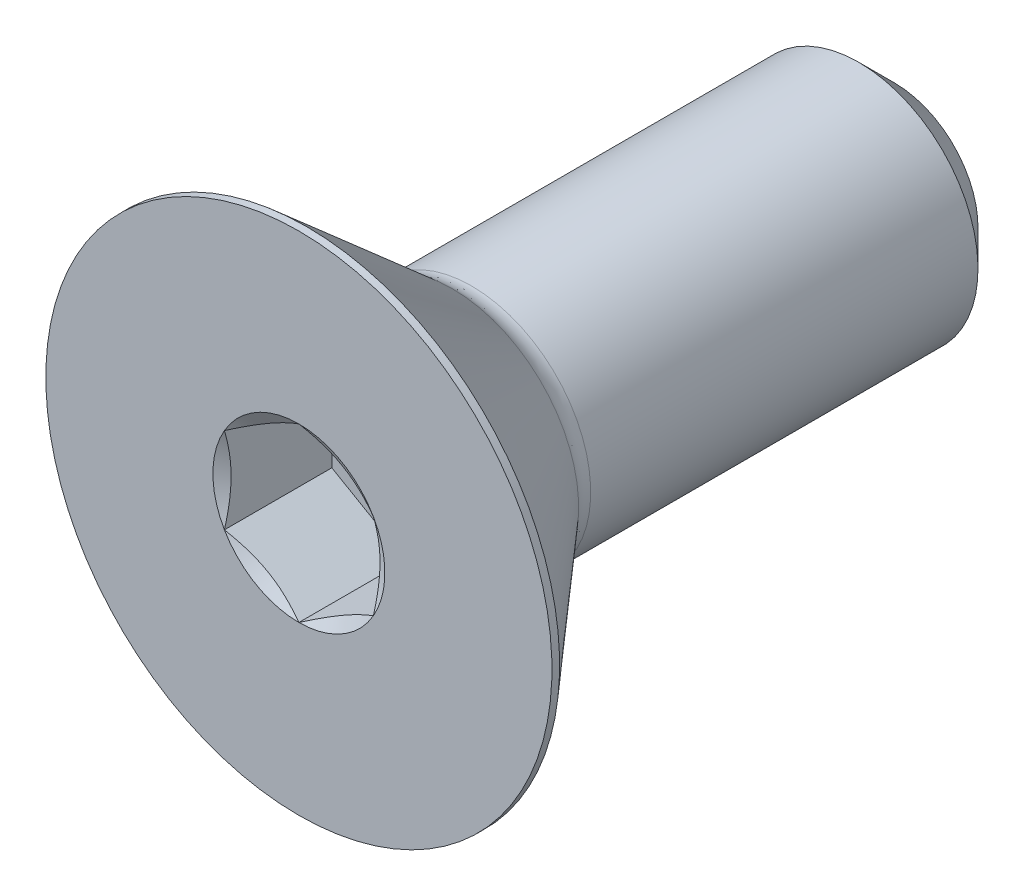
ISO-10303-21;
HEADER;
FILE_DESCRIPTION(('STEP AP214'),'2;1');
FILE_NAME('part.step','',(''),(''),'','','');
FILE_SCHEMA(('AUTOMOTIVE_DESIGN { 1 0 10303 214 1 1 1 1 }'));
ENDSEC;
DATA;
#1=APPLICATION_CONTEXT('core data for automotive mechanical design processes');
#2=APPLICATION_PROTOCOL_DEFINITION('international standard','automotive_design',2000,#1);
#3=PRODUCT_CONTEXT('',#1,'mechanical');
#4=PRODUCT('Part','Part','',(#3));
#5=PRODUCT_RELATED_PRODUCT_CATEGORY('part','',(#4));
#6=PRODUCT_DEFINITION_FORMATION('','',#4);
#7=PRODUCT_DEFINITION_CONTEXT('part definition',#1,'design');
#8=PRODUCT_DEFINITION('design','',#6,#7);
#9=PRODUCT_DEFINITION_SHAPE('','',#8);
#10=(LENGTH_UNIT() NAMED_UNIT(*) SI_UNIT(.MILLI.,.METRE.));
#11=(NAMED_UNIT(*) PLANE_ANGLE_UNIT() SI_UNIT($,.RADIAN.));
#12=(NAMED_UNIT(*) SI_UNIT($,.STERADIAN.) SOLID_ANGLE_UNIT());
#13=UNCERTAINTY_MEASURE_WITH_UNIT(LENGTH_MEASURE(1.E-05),#10,'distance_accuracy_value','');
#14=(GEOMETRIC_REPRESENTATION_CONTEXT(3) GLOBAL_UNCERTAINTY_ASSIGNED_CONTEXT((#13)) GLOBAL_UNIT_ASSIGNED_CONTEXT((#10,
#11,#12)) REPRESENTATION_CONTEXT('',''));
#15=CARTESIAN_POINT('',(0.,0.,0.));
#16=DIRECTION('',(0.,0.,1.));
#17=DIRECTION('',(1.,0.,0.));
#18=AXIS2_PLACEMENT_3D('',#15,#16,#17);
#19=CARTESIAN_POINT('',(0.,0.,-15.875));
#20=DIRECTION('',(0.,0.,-1.));
#21=DIRECTION('',(0.,1.,0.));
#22=AXIS2_PLACEMENT_3D('',#19,#20,#21);
#23=CYLINDRICAL_SURFACE('',#22,3.175);
#24=CARTESIAN_POINT('',(0.,0.,-14.9225));
#25=DIRECTION('',(0.,0.,-1.));
#26=DIRECTION('',(0.,1.,0.));
#27=AXIS2_PLACEMENT_3D('',#24,#25,#26);
#28=CIRCLE('',#27,3.175);
#29=CARTESIAN_POINT('',(0.,3.175,-14.9225));
#30=VERTEX_POINT('',#29);
#31=EDGE_CURVE('E49',#30,#30,#28,.F.);
#32=ORIENTED_EDGE('',*,*,#31,.T.);
#33=EDGE_LOOP('',(#32));
#34=FACE_BOUND('',#33,.T.);
#35=CARTESIAN_POINT('',(0.,0.,-4.60180899712602));
#36=DIRECTION('',(0.,0.,1.));
#37=DIRECTION('',(0.,-1.,0.));
#38=AXIS2_PLACEMENT_3D('',#35,#36,#37);
#39=CIRCLE('',#38,3.175);
#40=CARTESIAN_POINT('',(0.,-3.175,-4.60180899712602));
#41=VERTEX_POINT('',#40);
#42=EDGE_CURVE('E208',#41,#41,#39,.T.);
#43=ORIENTED_EDGE('',*,*,#42,.F.);
#44=EDGE_LOOP('',(#43));
#45=FACE_BOUND('',#44,.T.);
#46=ADVANCED_FACE('F36',(#34,#45),#23,.T.);
#47=CARTESIAN_POINT('',(0.,-3.175,-15.875));
#48=DIRECTION('',(0.,0.,-1.));
#49=DIRECTION('',(0.,1.,0.));
#50=AXIS2_PLACEMENT_3D('',#47,#48,#49);
#51=PLANE('',#50);
#52=CARTESIAN_POINT('',(0.,0.,-15.875));
#53=DIRECTION('',(0.,0.,-1.));
#54=DIRECTION('',(0.,1.,0.));
#55=AXIS2_PLACEMENT_3D('',#52,#53,#54);
#56=CIRCLE('',#55,2.2225);
#57=CARTESIAN_POINT('',(0.,2.2225,-15.875));
#58=VERTEX_POINT('',#57);
#59=EDGE_CURVE('E211',#58,#58,#56,.T.);
#60=ORIENTED_EDGE('',*,*,#59,.T.);
#61=EDGE_LOOP('',(#60));
#62=FACE_BOUND('',#61,.T.);
#63=ADVANCED_FACE('F221',(#62),#51,.T.);
#64=CARTESIAN_POINT('',(0.,0.,-15.875));
#65=DIRECTION('',(0.,0.,1.));
#66=DIRECTION('',(0.,-1.,0.));
#67=AXIS2_PLACEMENT_3D('',#64,#65,#66);
#68=CONICAL_SURFACE('',#67,2.2225,0.785398163397446);
#69=ORIENTED_EDGE('',*,*,#31,.F.);
#70=EDGE_LOOP('',(#69));
#71=FACE_BOUND('',#70,.T.);
#72=ORIENTED_EDGE('',*,*,#59,.F.);
#73=EDGE_LOOP('',(#72));
#74=FACE_BOUND('',#73,.T.);
#75=ADVANCED_FACE('F38',(#71,#74),#68,.T.);
#76=CARTESIAN_POINT('',(0.,0.,-4.60180899712602));
#77=DIRECTION('',(0.,0.,1.));
#78=DIRECTION('',(0.,-1.,0.));
#79=AXIS2_PLACEMENT_3D('',#76,#77,#78);
#80=TOROIDAL_SURFACE('',#79,3.95604099552517,0.781040995525164);
#81=CARTESIAN_POINT('',(0.,0.,-4.0894));
#82=DIRECTION('',(0.,0.,1.));
#83=DIRECTION('',(0.,-1.,0.));
#84=AXIS2_PLACEMENT_3D('',#81,#82,#83);
#85=CIRCLE('',#84,3.36658187365559);
#86=CARTESIAN_POINT('',(0.,-3.36658187365559,-4.0894));
#87=VERTEX_POINT('',#86);
#88=EDGE_CURVE('E205',#87,#87,#85,.T.);
#89=ORIENTED_EDGE('',*,*,#88,.F.);
#90=EDGE_LOOP('',(#89));
#91=FACE_BOUND('',#90,.T.);
#92=ORIENTED_EDGE('',*,*,#42,.T.);
#93=EDGE_LOOP('',(#92));
#94=FACE_BOUND('',#93,.T.);
#95=ADVANCED_FACE('F220',(#91,#94),#80,.F.);
#96=CARTESIAN_POINT('',(0.,0.,-4.0894));
#97=DIRECTION('',(0.,0.,1.));
#98=DIRECTION('',(0.,-1.,0.));
#99=AXIS2_PLACEMENT_3D('',#96,#97,#98);
#100=CONICAL_SURFACE('',#99,3.36658187365559,0.715584993317677);
#101=CARTESIAN_POINT('',(0.,0.,-0.204469999999999));
#102=DIRECTION('',(0.,0.,1.));
#103=DIRECTION('',(0.,-1.,0.));
#104=AXIS2_PLACEMENT_3D('',#101,#102,#103);
#105=CIRCLE('',#104,6.7437);
#106=CARTESIAN_POINT('',(0.,-6.7437,-0.204469999999999));
#107=VERTEX_POINT('',#106);
#108=EDGE_CURVE('E202',#107,#107,#105,.T.);
#109=ORIENTED_EDGE('',*,*,#108,.F.);
#110=EDGE_LOOP('',(#109));
#111=FACE_BOUND('',#110,.T.);
#112=ORIENTED_EDGE('',*,*,#88,.T.);
#113=EDGE_LOOP('',(#112));
#114=FACE_BOUND('',#113,.T.);
#115=ADVANCED_FACE('F233',(#111,#114),#100,.T.);
#116=CARTESIAN_POINT('',(0.,0.,0.));
#117=DIRECTION('',(0.,0.,1.));
#118=DIRECTION('',(0.,-1.,0.));
#119=AXIS2_PLACEMENT_3D('',#116,#117,#118);
#120=CYLINDRICAL_SURFACE('',#119,6.7437);
#121=CARTESIAN_POINT('',(0.,0.,0.));
#122=DIRECTION('',(0.,0.,1.));
#123=DIRECTION('',(0.,-1.,0.));
#124=AXIS2_PLACEMENT_3D('',#121,#122,#123);
#125=CIRCLE('',#124,6.7437);
#126=CARTESIAN_POINT('',(0.,-6.7437,0.));
#127=VERTEX_POINT('',#126);
#128=EDGE_CURVE('E190',#127,#127,#125,.T.);
#129=ORIENTED_EDGE('',*,*,#128,.F.);
#130=EDGE_LOOP('',(#129));
#131=FACE_BOUND('',#130,.T.);
#132=ORIENTED_EDGE('',*,*,#108,.T.);
#133=EDGE_LOOP('',(#132));
#134=FACE_BOUND('',#133,.T.);
#135=ADVANCED_FACE('F165',(#131,#134),#120,.T.);
#136=CARTESIAN_POINT('',(0.,-3.175,0.));
#137=DIRECTION('',(0.,0.,1.));
#138=DIRECTION('',(0.,-1.,0.));
#139=AXIS2_PLACEMENT_3D('',#136,#137,#138);
#140=PLANE('',#139);
#141=CARTESIAN_POINT('',(0.,0.,0.));
#142=DIRECTION('',(0.,0.,1.));
#143=DIRECTION('',(1.,0.,0.));
#144=AXIS2_PLACEMENT_3D('',#141,#142,#143);
#145=CIRCLE('',#144,2.29135888084633);
#146=CARTESIAN_POINT('',(0.,-2.29135888084633,0.));
#147=VERTEX_POINT('',#146);
#148=CARTESIAN_POINT('',(1.984375,-1.14567944042316,0.));
#149=VERTEX_POINT('',#148);
#150=EDGE_CURVE('E62',#147,#149,#145,.T.);
#151=ORIENTED_EDGE('',*,*,#150,.F.);
#152=CARTESIAN_POINT('',(-1.984375,-1.14567944042316,0.));
#153=VERTEX_POINT('',#152);
#154=EDGE_CURVE('E134',#153,#147,#145,.T.);
#155=ORIENTED_EDGE('',*,*,#154,.F.);
#156=CARTESIAN_POINT('',(-1.984375,1.14567944042317,0.));
#157=VERTEX_POINT('',#156);
#158=EDGE_CURVE('E133',#157,#153,#145,.T.);
#159=ORIENTED_EDGE('',*,*,#158,.F.);
#160=CARTESIAN_POINT('',(0.,2.29135888084633,0.));
#161=VERTEX_POINT('',#160);
#162=EDGE_CURVE('E103',#161,#157,#145,.T.);
#163=ORIENTED_EDGE('',*,*,#162,.F.);
#164=CARTESIAN_POINT('',(1.984375,1.14567944042316,0.));
#165=VERTEX_POINT('',#164);
#166=EDGE_CURVE('E94',#165,#161,#145,.T.);
#167=ORIENTED_EDGE('',*,*,#166,.F.);
#168=EDGE_CURVE('E55',#149,#165,#145,.T.);
#169=ORIENTED_EDGE('',*,*,#168,.F.);
#170=EDGE_LOOP('',(#151,#155,#159,#163,#167,#169));
#171=FACE_BOUND('',#170,.T.);
#172=ORIENTED_EDGE('',*,*,#128,.T.);
#173=EDGE_LOOP('',(#172));
#174=FACE_BOUND('',#173,.T.);
#175=ADVANCED_FACE('F129',(#171,#174),#140,.T.);
#176=CARTESIAN_POINT('',(0.,0.,0.));
#177=DIRECTION('',(0.,0.,1.));
#178=DIRECTION('',(1.,0.,0.));
#179=AXIS2_PLACEMENT_3D('',#176,#177,#178);
#180=CONICAL_SURFACE('',#179,2.29135888084633,1.0471975511966);
#181=ORIENTED_EDGE('',*,*,#162,.T.);
#182=CARTESIAN_POINT('',(0.000199999999999609,2.29147435090017,6.66717057831416E-05));
#183=CARTESIAN_POINT('',(-0.0870046387806768,2.24112672922556,-0.029014317759813));
#184=CARTESIAN_POINT('',(-0.174962019304997,2.19034451190263,-0.0554627919729485));
#185=CARTESIAN_POINT('',(-0.35239997867232,2.08790065829745,-0.101629728793529));
#186=CARTESIAN_POINT('',(-0.441883711256319,2.03623720120198,-0.121331857751036));
#187=CARTESIAN_POINT('',(-0.619742148012469,1.93355058486317,-0.152002268068471));
#188=CARTESIAN_POINT('',(-0.708089480306094,1.88254322878126,-0.163174657279787));
#189=CARTESIAN_POINT('',(-0.88520002811095,1.78028840632981,-0.176514203945575));
#190=CARTESIAN_POINT('',(-0.973962599510547,1.72904131183829,-0.178692405539878));
#191=CARTESIAN_POINT('',(-1.13983230286466,1.63327639395638,-0.174170448491651));
#192=CARTESIAN_POINT('',(-1.21696421566591,1.58874426333747,-0.168580586544127));
#193=CARTESIAN_POINT('',(-1.37072550718908,1.49997014028563,-0.150861066102989));
#194=CARTESIAN_POINT('',(-1.44735435374552,1.45572845509857,-0.138725349670475));
#195=CARTESIAN_POINT('',(-1.60143288850678,1.36677117157782,-0.108385841155635));
#196=CARTESIAN_POINT('',(-1.67886306721268,1.32206683705857,-0.09005339070901));
#197=CARTESIAN_POINT('',(-1.83256831124359,1.23332507304146,-0.0484454935998176));
#198=CARTESIAN_POINT('',(-1.90884534705293,1.18928650588395,-0.0251798287176209));
#199=CARTESIAN_POINT('',(-1.984575,1.14556397036933,6.66717057829762E-05));
#200=B_SPLINE_CURVE_WITH_KNOTS('',3,(#182,#183,#184,#185,#186,#187,#188,#189,#190,#191,#192,
#193,#194,#195,#196,#197,#198,#199),.UNSPECIFIED.,.F.,.F.,(4,2,2,2,2,2,2,2,4),(0.,
0.314555137114086,0.629866549668806,0.937373439505933,1.24450262309398,1.51196650590478,
1.77967834211415,2.05332989762155,2.32644383656793),.UNSPECIFIED.);
#201=EDGE_CURVE('E11',#161,#157,#200,.T.);
#202=ORIENTED_EDGE('',*,*,#201,.F.);
#203=EDGE_LOOP('',(#181,#202));
#204=FACE_BOUND('',#203,.T.);
#205=ADVANCED_FACE('F107',(#204),#180,.F.);
#206=ORIENTED_EDGE('',*,*,#158,.T.);
#207=CARTESIAN_POINT('',(-1.984375,-2.96692860034507,0.737860651092377));
#208=CARTESIAN_POINT('',(-1.984375,-2.88123645369667,0.69674880177529));
#209=CARTESIAN_POINT('',(-1.984375,-2.79533554929687,0.656063972956056));
#210=CARTESIAN_POINT('',(-1.984375,-2.62300496253372,0.575790597945192));
#211=CARTESIAN_POINT('',(-1.984375,-2.53657518838115,0.536202249047077));
#212=CARTESIAN_POINT('',(-1.984375,-2.36258003650985,0.458142914429596));
#213=CARTESIAN_POINT('',(-1.984375,-2.27501095051754,0.419680163398946));
#214=CARTESIAN_POINT('',(-1.984375,-2.09913795632987,0.344479427097519));
#215=CARTESIAN_POINT('',(-1.984375,-2.01083408662377,0.307741352146445));
#216=CARTESIAN_POINT('',(-1.984375,-1.83102497893539,0.235513729354963));
#217=CARTESIAN_POINT('',(-1.984375,-1.73949640320228,0.200081939073892));
#218=CARTESIAN_POINT('',(-1.984375,-1.55533214713673,0.132164183556778));
#219=CARTESIAN_POINT('',(-1.984375,-1.46269633980312,0.0996785599926462));
#220=CARTESIAN_POINT('',(-1.984375,-1.27638419434466,0.0385821363592113));
#221=CARTESIAN_POINT('',(-1.984375,-1.18271082678456,0.00996237523819853));
#222=CARTESIAN_POINT('',(-1.984375,-0.994021652382587,-0.0424236311394211));
#223=CARTESIAN_POINT('',(-1.984375,-0.899006185229732,-0.0661910818015453));
#224=CARTESIAN_POINT('',(-1.984375,-0.70783051245842,-0.107605260619429));
#225=CARTESIAN_POINT('',(-1.984375,-0.611673084373239,-0.125264559933971));
#226=CARTESIAN_POINT('',(-1.984375,-0.418283092113672,-0.153306903466505));
#227=CARTESIAN_POINT('',(-1.984375,-0.32105060104525,-0.163690439394072));
#228=CARTESIAN_POINT('',(-1.984375,-0.127210752774483,-0.176214799009401));
#229=CARTESIAN_POINT('',(-1.984375,-0.0306098639781231,-0.178452892631436));
#230=CARTESIAN_POINT('',(-1.984375,0.162431915887106,-0.17475795296783));
#231=CARTESIAN_POINT('',(-1.984375,0.258872796678698,-0.168824413724938));
#232=CARTESIAN_POINT('',(-1.984375,0.496826477184735,-0.144624426308478));
#233=CARTESIAN_POINT('',(-1.984375,0.637878211825128,-0.121822779785831));
#234=CARTESIAN_POINT('',(-1.984375,0.91723870370253,-0.0630239757386336));
#235=CARTESIAN_POINT('',(-1.984375,1.05554394232965,-0.0270109144574765));
#236=CARTESIAN_POINT('',(-1.984375,1.26239464896717,0.0345082078903479));
#237=CARTESIAN_POINT('',(-1.984375,1.33200934564274,0.0565514264145546));
#238=CARTESIAN_POINT('',(-1.984375,1.47051409380588,0.102676986257499));
#239=CARTESIAN_POINT('',(-1.984375,1.53940456776433,0.126758055006123));
#240=CARTESIAN_POINT('',(-1.984375,1.67655293465251,0.176609588689456));
#241=CARTESIAN_POINT('',(-1.984375,1.74481093998431,0.202379746602285));
#242=CARTESIAN_POINT('',(-1.984375,1.88078910071683,0.255330712681564));
#243=CARTESIAN_POINT('',(-1.984375,1.94850916300286,0.282511759182964));
#244=CARTESIAN_POINT('',(-1.984375,2.12136731788458,0.353633623835928));
#245=CARTESIAN_POINT('',(-1.984375,2.22615977384556,0.398413596701326));
#246=CARTESIAN_POINT('',(-1.984375,2.43479837304527,0.490132195682473));
#247=CARTESIAN_POINT('',(-1.984375,2.5386444446916,0.537070983511256));
#248=CARTESIAN_POINT('',(-1.984375,2.84907841644385,0.680364561323518));
#249=CARTESIAN_POINT('',(-1.984375,3.05452739791262,0.77918187526435));
#250=CARTESIAN_POINT('',(-1.984375,3.46367014223902,0.980960885724764));
#251=CARTESIAN_POINT('',(-1.984375,3.66736143684958,1.08392752775299));
#252=CARTESIAN_POINT('',(-1.984375,4.07334844866211,1.29250841655482));
#253=CARTESIAN_POINT('',(-1.984375,4.27564433912763,1.39812232679349));
#254=CARTESIAN_POINT('',(-1.984375,4.66022184962415,1.60111933686162));
#255=CARTESIAN_POINT('',(-1.984375,4.84259034249047,1.69833842729249));
#256=CARTESIAN_POINT('',(-1.984375,5.20674070245669,1.89388432048827));
#257=CARTESIAN_POINT('',(-1.984375,5.38852254752481,1.99221116424656));
#258=CARTESIAN_POINT('',(-1.984375,5.75117247931181,2.18944361750704));
#259=CARTESIAN_POINT('',(-1.984375,5.93204171415673,2.2883471187779));
#260=CARTESIAN_POINT('',(-1.984375,6.29341450955436,2.48679783989033));
#261=CARTESIAN_POINT('',(-1.984375,6.47391808874828,2.5863450257738));
#262=CARTESIAN_POINT('',(-1.984375,6.6542902961452,2.6861282522634));
#263=B_SPLINE_CURVE_WITH_KNOTS('',3,(#207,#208,#209,#210,#211,#212,#213,#214,#215,#216,#217,
#218,#219,#220,#221,#222,#223,#224,#225,#226,#227,#228,#229,#230,#231,#232,#233,#234,#235,#236,
#237,#238,#239,#240,#241,#242,#243,#244,#245,#246,#247,#248,#249,#250,#251,#252,#253,#254,#255,
#256,#257,#258,#259,#260,#261,#262),.UNSPECIFIED.,.F.,.F.,(4,2,2,2,2,2,2,2,2,2,2,2,2,2,2,2,2,2,
2,2,2,2,2,2,2,2,2,4),(0.,0.285135519832373,0.570322016122788,0.857238463819792,1.14413997577449,
1.43854271801315,1.7329795590899,2.02672173491208,2.32039085060263,2.61345191984504,
2.90649318156653,3.19602335108128,3.48557144803805,3.91334047285799,4.34162614021154,
4.56066589824458,4.77956986852721,4.99843415889189,5.21733554208811,5.55917796423187,
5.90104603503021,6.58489509249957,7.26958483186157,7.95418796687477,8.57417425374278,
9.1941835596094,9.81261585701217,10.431015790458),.UNSPECIFIED.);
#264=EDGE_CURVE('E102',#157,#153,#263,.F.);
#265=ORIENTED_EDGE('',*,*,#264,.F.);
#266=EDGE_LOOP('',(#206,#265));
#267=FACE_BOUND('',#266,.T.);
#268=ADVANCED_FACE('F261',(#267),#180,.F.);
#269=ORIENTED_EDGE('',*,*,#154,.T.);
#270=CARTESIAN_POINT('',(-1.984575,-1.14556397036933,6.66717057829649E-05));
#271=CARTESIAN_POINT('',(-1.89737036121932,-1.19591159204393,-0.0290143177598132));
#272=CARTESIAN_POINT('',(-1.809412980695,-1.24669380936686,-0.0554627919729487));
#273=CARTESIAN_POINT('',(-1.63197502132768,-1.34913766297205,-0.101629728793529));
#274=CARTESIAN_POINT('',(-1.54249128874368,-1.40080112006751,-0.121331857751037));
#275=CARTESIAN_POINT('',(-1.36463285198753,-1.50348773640632,-0.152002268068471));
#276=CARTESIAN_POINT('',(-1.27628551969391,-1.55449509248823,-0.163174657279787));
#277=CARTESIAN_POINT('',(-1.09917497188905,-1.65674991493968,-0.176514203945575));
#278=CARTESIAN_POINT('',(-1.01041240048945,-1.70799700943121,-0.178692405539878));
#279=CARTESIAN_POINT('',(-0.844542697135338,-1.80376192731311,-0.174170448491652));
#280=CARTESIAN_POINT('',(-0.767410784334093,-1.84829405793202,-0.168580586544128));
#281=CARTESIAN_POINT('',(-0.613649492810919,-1.93706818098387,-0.150861066102989));
#282=CARTESIAN_POINT('',(-0.537020646254476,-1.98130986617092,-0.138725349670476));
#283=CARTESIAN_POINT('',(-0.382942111493217,-2.07026714969167,-0.108385841155636));
#284=CARTESIAN_POINT('',(-0.305511932787318,-2.11497148421093,-0.0900533907090107));
#285=CARTESIAN_POINT('',(-0.151806688756412,-2.20371324822803,-0.0484454935998183));
#286=CARTESIAN_POINT('',(-0.075529652947068,-2.24775181538554,-0.0251798287176216));
#287=CARTESIAN_POINT('',(0.000199999999999772,-2.29147435090016,6.66717057822253E-05));
#288=B_SPLINE_CURVE_WITH_KNOTS('',3,(#270,#271,#272,#273,#274,#275,#276,#277,#278,#279,#280,
#281,#282,#283,#284,#285,#286,#287),.UNSPECIFIED.,.F.,.F.,(4,2,2,2,2,2,2,2,4),(0.,
0.314555137114086,0.629866549668806,0.937373439505932,1.24450262309398,1.51196650590478,
1.77967834211415,2.05332989762155,2.32644383656793),.UNSPECIFIED.);
#289=EDGE_CURVE('E142',#153,#147,#288,.T.);
#290=ORIENTED_EDGE('',*,*,#289,.F.);
#291=EDGE_LOOP('',(#269,#290));
#292=FACE_BOUND('',#291,.T.);
#293=ADVANCED_FACE('F267',(#292),#180,.F.);
#294=ORIENTED_EDGE('',*,*,#150,.T.);
#295=CARTESIAN_POINT('',(-0.000200000000000051,-2.29147435090016,6.66717057826408E-05));
#296=CARTESIAN_POINT('',(0.0870046387806763,-2.24112672922556,-0.0290143177598132));
#297=CARTESIAN_POINT('',(0.174962019304996,-2.19034451190263,-0.0554627919729487));
#298=CARTESIAN_POINT('',(0.352399978672319,-2.08790065829744,-0.101629728793529));
#299=CARTESIAN_POINT('',(0.441883711256319,-2.03623720120198,-0.121331857751037));
#300=CARTESIAN_POINT('',(0.619742148012468,-1.93355058486317,-0.152002268068471));
#301=CARTESIAN_POINT('',(0.708089480306093,-1.88254322878126,-0.163174657279787));
#302=CARTESIAN_POINT('',(0.885200028110949,-1.78028840632981,-0.176514203945575));
#303=CARTESIAN_POINT('',(0.973962599510546,-1.72904131183829,-0.178692405539878));
#304=CARTESIAN_POINT('',(1.13983230286466,-1.63327639395638,-0.174170448491652));
#305=CARTESIAN_POINT('',(1.21696421566591,-1.58874426333747,-0.168580586544128));
#306=CARTESIAN_POINT('',(1.37072550718908,-1.49997014028563,-0.150861066102989));
#307=CARTESIAN_POINT('',(1.44735435374552,-1.45572845509857,-0.138725349670476));
#308=CARTESIAN_POINT('',(1.60143288850678,-1.36677117157782,-0.108385841155636));
#309=CARTESIAN_POINT('',(1.67886306721268,-1.32206683705856,-0.0900533907090105));
#310=CARTESIAN_POINT('',(1.83256831124359,-1.23332507304146,-0.0484454935998179));
#311=CARTESIAN_POINT('',(1.90884534705293,-1.18928650588395,-0.0251798287176211));
#312=CARTESIAN_POINT('',(1.984575,-1.14556397036933,6.66717057827258E-05));
#313=B_SPLINE_CURVE_WITH_KNOTS('',3,(#295,#296,#297,#298,#299,#300,#301,#302,#303,#304,#305,
#306,#307,#308,#309,#310,#311,#312),.UNSPECIFIED.,.F.,.F.,(4,2,2,2,2,2,2,2,4),(0.,
0.314555137114085,0.629866549668806,0.937373439505932,1.24450262309398,1.51196650590478,
1.77967834211415,2.05332989762155,2.32644383656793),.UNSPECIFIED.);
#314=EDGE_CURVE('E390',#147,#149,#313,.T.);
#315=ORIENTED_EDGE('',*,*,#314,.F.);
#316=EDGE_LOOP('',(#294,#315));
#317=FACE_BOUND('',#316,.T.);
#318=ADVANCED_FACE('F274',(#317),#180,.F.);
#319=ORIENTED_EDGE('',*,*,#168,.T.);
#320=CARTESIAN_POINT('',(1.984375,-2.96692860034507,0.737860651092378));
#321=CARTESIAN_POINT('',(1.984375,-2.88123645369666,0.69674880177529));
#322=CARTESIAN_POINT('',(1.984375,-2.79533554929687,0.656063972956056));
#323=CARTESIAN_POINT('',(1.984375,-2.62300496253372,0.575790597945192));
#324=CARTESIAN_POINT('',(1.984375,-2.53657518838115,0.536202249047077));
#325=CARTESIAN_POINT('',(1.984375,-2.36258003650985,0.458142914429596));
#326=CARTESIAN_POINT('',(1.984375,-2.27501095051754,0.419680163398946));
#327=CARTESIAN_POINT('',(1.984375,-2.09913795632987,0.344479427097519));
#328=CARTESIAN_POINT('',(1.984375,-2.01083408662377,0.307741352146445));
#329=CARTESIAN_POINT('',(1.984375,-1.83102497893539,0.235513729354964));
#330=CARTESIAN_POINT('',(1.984375,-1.73949640320228,0.200081939073892));
#331=CARTESIAN_POINT('',(1.984375,-1.55533214713673,0.132164183556778));
#332=CARTESIAN_POINT('',(1.984375,-1.46269633980312,0.0996785599926464));
#333=CARTESIAN_POINT('',(1.984375,-1.27638419434466,0.0385821363592116));
#334=CARTESIAN_POINT('',(1.984375,-1.18271082678456,0.00996237523819882));
#335=CARTESIAN_POINT('',(1.984375,-0.994021652382587,-0.042423631139421));
#336=CARTESIAN_POINT('',(1.984375,-0.899006185229731,-0.0661910818015453));
#337=CARTESIAN_POINT('',(1.984375,-0.70783051245842,-0.107605260619429));
#338=CARTESIAN_POINT('',(1.984375,-0.611673084373239,-0.125264559933971));
#339=CARTESIAN_POINT('',(1.984375,-0.418283092113671,-0.153306903466505));
#340=CARTESIAN_POINT('',(1.984375,-0.32105060104525,-0.163690439394072));
#341=CARTESIAN_POINT('',(1.984375,-0.127210752774482,-0.176214799009401));
#342=CARTESIAN_POINT('',(1.984375,-0.0306098639781227,-0.178452892631436));
#343=CARTESIAN_POINT('',(1.984375,0.162431915887107,-0.17475795296783));
#344=CARTESIAN_POINT('',(1.984375,0.258872796678699,-0.168824413724938));
#345=CARTESIAN_POINT('',(1.984375,0.496826477184735,-0.144624426308478));
#346=CARTESIAN_POINT('',(1.984375,0.637878211825129,-0.12182277978583));
#347=CARTESIAN_POINT('',(1.984375,0.91723870370253,-0.0630239757386333));
#348=CARTESIAN_POINT('',(1.984375,1.05554394232965,-0.0270109144574763));
#349=CARTESIAN_POINT('',(1.984375,1.26239464896717,0.0345082078903483));
#350=CARTESIAN_POINT('',(1.984375,1.33200934564274,0.0565514264145553));
#351=CARTESIAN_POINT('',(1.984375,1.47051409380588,0.1026769862575));
#352=CARTESIAN_POINT('',(1.984375,1.53940456776433,0.126758055006124));
#353=CARTESIAN_POINT('',(1.984375,1.67655293465251,0.176609588689457));
#354=CARTESIAN_POINT('',(1.984375,1.74481093998432,0.202379746602286));
#355=CARTESIAN_POINT('',(1.984375,1.88078910071683,0.255330712681565));
#356=CARTESIAN_POINT('',(1.984375,1.94850916300287,0.282511759182965));
#357=CARTESIAN_POINT('',(1.984375,2.12136731788458,0.353633623835929));
#358=CARTESIAN_POINT('',(1.984375,2.22615977384557,0.398413596701327));
#359=CARTESIAN_POINT('',(1.984375,2.43479837304527,0.490132195682473));
#360=CARTESIAN_POINT('',(1.984375,2.5386444446916,0.537070983511257));
#361=CARTESIAN_POINT('',(1.984375,2.84907841644385,0.680364561323519));
#362=CARTESIAN_POINT('',(1.984375,3.05452739791262,0.779181875264351));
#363=CARTESIAN_POINT('',(1.984375,3.46367014223902,0.980960885724765));
#364=CARTESIAN_POINT('',(1.984375,3.66736143684958,1.08392752775299));
#365=CARTESIAN_POINT('',(1.984375,4.07334844866211,1.29250841655482));
#366=CARTESIAN_POINT('',(1.984375,4.27564433912763,1.3981223267935));
#367=CARTESIAN_POINT('',(1.984375,4.66022184962416,1.60111933686162));
#368=CARTESIAN_POINT('',(1.984375,4.84259034249048,1.6983384272925));
#369=CARTESIAN_POINT('',(1.984375,5.2067407024567,1.89388432048827));
#370=CARTESIAN_POINT('',(1.984375,5.38852254752481,1.99221116424656));
#371=CARTESIAN_POINT('',(1.984375,5.75117247931181,2.18944361750704));
#372=CARTESIAN_POINT('',(1.984375,5.93204171415673,2.2883471187779));
#373=CARTESIAN_POINT('',(1.984375,6.29341450955436,2.48679783989034));
#374=CARTESIAN_POINT('',(1.984375,6.47391808874828,2.5863450257738));
#375=CARTESIAN_POINT('',(1.984375,6.6542902961452,2.6861282522634));
#376=B_SPLINE_CURVE_WITH_KNOTS('',3,(#320,#321,#322,#323,#324,#325,#326,#327,#328,#329,#330,
#331,#332,#333,#334,#335,#336,#337,#338,#339,#340,#341,#342,#343,#344,#345,#346,#347,#348,#349,
#350,#351,#352,#353,#354,#355,#356,#357,#358,#359,#360,#361,#362,#363,#364,#365,#366,#367,#368,
#369,#370,#371,#372,#373,#374,#375),.UNSPECIFIED.,.F.,.F.,(4,2,2,2,2,2,2,2,2,2,2,2,2,2,2,2,2,2,
2,2,2,2,2,2,2,2,2,4),(0.,0.285135519832374,0.570322016122787,0.857238463819791,1.14413997577449,
1.43854271801315,1.7329795590899,2.02672173491208,2.32039085060263,2.61345191984504,
2.90649318156653,3.19602335108128,3.48557144803805,3.91334047285799,4.34162614021154,
4.56066589824458,4.77956986852721,4.9984341588919,5.21733554208812,5.55917796423187,
5.90104603503021,6.58489509249957,7.26958483186157,7.95418796687478,8.57417425374278,
9.1941835596094,9.81261585701217,10.431015790458),.UNSPECIFIED.);
#377=EDGE_CURVE('E119',#149,#165,#376,.T.);
#378=ORIENTED_EDGE('',*,*,#377,.F.);
#379=EDGE_LOOP('',(#319,#378));
#380=FACE_BOUND('',#379,.T.);
#381=ADVANCED_FACE('F281',(#380),#180,.F.);
#382=ORIENTED_EDGE('',*,*,#166,.T.);
#383=CARTESIAN_POINT('',(1.984575,1.14556397036933,6.66717057832154E-05));
#384=CARTESIAN_POINT('',(1.89737036121932,1.19591159204393,-0.029014317759813));
#385=CARTESIAN_POINT('',(1.809412980695,1.24669380936687,-0.0554627919729485));
#386=CARTESIAN_POINT('',(1.63197502132768,1.34913766297205,-0.101629728793529));
#387=CARTESIAN_POINT('',(1.54249128874368,1.40080112006751,-0.121331857751036));
#388=CARTESIAN_POINT('',(1.36463285198753,1.50348773640632,-0.152002268068471));
#389=CARTESIAN_POINT('',(1.27628551969391,1.55449509248823,-0.163174657279786));
#390=CARTESIAN_POINT('',(1.09917497188905,1.65674991493969,-0.176514203945575));
#391=CARTESIAN_POINT('',(1.01041240048945,1.70799700943121,-0.178692405539878));
#392=CARTESIAN_POINT('',(0.844542697135338,1.80376192731311,-0.174170448491651));
#393=CARTESIAN_POINT('',(0.767410784334093,1.84829405793202,-0.168580586544127));
#394=CARTESIAN_POINT('',(0.613649492810919,1.93706818098387,-0.150861066102989));
#395=CARTESIAN_POINT('',(0.537020646254476,1.98130986617092,-0.138725349670475));
#396=CARTESIAN_POINT('',(0.382942111493217,2.07026714969167,-0.108385841155635));
#397=CARTESIAN_POINT('',(0.305511932787317,2.11497148421093,-0.0900533907090102));
#398=CARTESIAN_POINT('',(0.151806688756411,2.20371324822803,-0.0484454935998178));
#399=CARTESIAN_POINT('',(0.0755296529470672,2.24775181538554,-0.0251798287176211));
#400=CARTESIAN_POINT('',(-0.000200000000000537,2.29147435090017,6.6671705782726E-05));
#401=B_SPLINE_CURVE_WITH_KNOTS('',3,(#383,#384,#385,#386,#387,#388,#389,#390,#391,#392,#393,
#394,#395,#396,#397,#398,#399,#400),.UNSPECIFIED.,.F.,.F.,(4,2,2,2,2,2,2,2,4),(0.,
0.314555137114086,0.629866549668806,0.937373439505933,1.24450262309398,1.51196650590478,
1.77967834211415,2.05332989762155,2.32644383656793),.UNSPECIFIED.);
#402=EDGE_CURVE('E98',#165,#161,#401,.T.);
#403=ORIENTED_EDGE('',*,*,#402,.F.);
#404=EDGE_LOOP('',(#382,#403));
#405=FACE_BOUND('',#404,.T.);
#406=ADVANCED_FACE('F96',(#405),#180,.F.);
#407=CARTESIAN_POINT('',(0.,2.29135888084633,-2.86258));
#408=DIRECTION('',(0.,0.,1.));
#409=DIRECTION('',(1.,0.,0.));
#410=AXIS2_PLACEMENT_3D('',#407,#408,#409);
#411=PLANE('',#410);
#412=DIRECTION('',(-0.866025403784439,0.5,0.));
#413=VECTOR('',#412,1.);
#414=CARTESIAN_POINT('',(1.984375,1.14567944042317,-2.86258));
#415=LINE('',#414,#413);
#416=CARTESIAN_POINT('',(1.984375,1.14567944042317,-2.86258));
#417=VERTEX_POINT('',#416);
#418=CARTESIAN_POINT('',(0.,2.29135888084633,-2.86258));
#419=VERTEX_POINT('',#418);
#420=EDGE_CURVE('E118',#417,#419,#415,.T.);
#421=ORIENTED_EDGE('',*,*,#420,.T.);
#422=DIRECTION('',(-0.866025403784439,-0.5,0.));
#423=VECTOR('',#422,1.);
#424=CARTESIAN_POINT('',(0.,2.29135888084633,-2.86258));
#425=LINE('',#424,#423);
#426=CARTESIAN_POINT('',(-1.984375,1.14567944042316,-2.86258));
#427=VERTEX_POINT('',#426);
#428=EDGE_CURVE('E123',#419,#427,#425,.T.);
#429=ORIENTED_EDGE('',*,*,#428,.T.);
#430=DIRECTION('',(0.,-1.,0.));
#431=VECTOR('',#430,1.);
#432=CARTESIAN_POINT('',(-1.984375,1.14567944042316,-2.86258));
#433=LINE('',#432,#431);
#434=CARTESIAN_POINT('',(-1.984375,-1.14567944042316,-2.86258));
#435=VERTEX_POINT('',#434);
#436=EDGE_CURVE('E178',#427,#435,#433,.T.);
#437=ORIENTED_EDGE('',*,*,#436,.T.);
#438=DIRECTION('',(0.866025403784439,-0.5,0.));
#439=VECTOR('',#438,1.);
#440=CARTESIAN_POINT('',(-1.984375,-1.14567944042316,-2.86258));
#441=LINE('',#440,#439);
#442=CARTESIAN_POINT('',(0.,-2.29135888084633,-2.86258));
#443=VERTEX_POINT('',#442);
#444=EDGE_CURVE('E181',#435,#443,#441,.T.);
#445=ORIENTED_EDGE('',*,*,#444,.T.);
#446=DIRECTION('',(0.866025403784439,0.5,0.));
#447=VECTOR('',#446,1.);
#448=CARTESIAN_POINT('',(0.,-2.29135888084633,-2.86258));
#449=LINE('',#448,#447);
#450=CARTESIAN_POINT('',(1.984375,-1.14567944042316,-2.86258));
#451=VERTEX_POINT('',#450);
#452=EDGE_CURVE('E184',#443,#451,#449,.T.);
#453=ORIENTED_EDGE('',*,*,#452,.T.);
#454=DIRECTION('',(0.,1.,0.));
#455=VECTOR('',#454,1.);
#456=CARTESIAN_POINT('',(1.984375,-1.14567944042316,-2.86258));
#457=LINE('',#456,#455);
#458=EDGE_CURVE('E126',#451,#417,#457,.T.);
#459=ORIENTED_EDGE('',*,*,#458,.T.);
#460=EDGE_LOOP('',(#421,#429,#437,#445,#453,#459));
#461=FACE_BOUND('',#460,.T.);
#462=ADVANCED_FACE('F160',(#461),#411,.T.);
#463=CARTESIAN_POINT('',(0.,2.29135888084633,-2.86258));
#464=DIRECTION('',(-0.5,0.866025403784439,0.));
#465=DIRECTION('',(-0.866025403784439,-0.5,0.));
#466=AXIS2_PLACEMENT_3D('',#463,#464,#465);
#467=PLANE('',#466);
#468=DIRECTION('',(0.,0.,1.));
#469=VECTOR('',#468,1.);
#470=CARTESIAN_POINT('',(0.,2.29135888084633,-2.86258));
#471=LINE('',#470,#469);
#472=EDGE_CURVE('E115',#419,#161,#471,.T.);
#473=ORIENTED_EDGE('',*,*,#472,.T.);
#474=ORIENTED_EDGE('',*,*,#201,.T.);
#475=DIRECTION('',(0.,0.,1.));
#476=VECTOR('',#475,1.);
#477=CARTESIAN_POINT('',(-1.984375,1.14567944042316,-2.86258));
#478=LINE('',#477,#476);
#479=EDGE_CURVE('E125',#427,#157,#478,.T.);
#480=ORIENTED_EDGE('',*,*,#479,.F.);
#481=ORIENTED_EDGE('',*,*,#428,.F.);
#482=EDGE_LOOP('',(#473,#474,#480,#481));
#483=FACE_BOUND('',#482,.T.);
#484=ADVANCED_FACE('F121',(#483),#467,.F.);
#485=CARTESIAN_POINT('',(-1.984375,1.14567944042316,-2.86258));
#486=DIRECTION('',(-1.,0.,0.));
#487=DIRECTION('',(0.,-1.,0.));
#488=AXIS2_PLACEMENT_3D('',#485,#486,#487);
#489=PLANE('',#488);
#490=ORIENTED_EDGE('',*,*,#479,.T.);
#491=ORIENTED_EDGE('',*,*,#264,.T.);
#492=DIRECTION('',(0.,0.,1.));
#493=VECTOR('',#492,1.);
#494=CARTESIAN_POINT('',(-1.984375,-1.14567944042316,-2.86258));
#495=LINE('',#494,#493);
#496=EDGE_CURVE('E197',#435,#153,#495,.T.);
#497=ORIENTED_EDGE('',*,*,#496,.F.);
#498=ORIENTED_EDGE('',*,*,#436,.F.);
#499=EDGE_LOOP('',(#490,#491,#497,#498));
#500=FACE_BOUND('',#499,.T.);
#501=ADVANCED_FACE('F150',(#500),#489,.F.);
#502=CARTESIAN_POINT('',(-1.984375,-1.14567944042316,-2.86258));
#503=DIRECTION('',(-0.5,-0.866025403784439,0.));
#504=DIRECTION('',(0.866025403784439,-0.5,0.));
#505=AXIS2_PLACEMENT_3D('',#502,#503,#504);
#506=PLANE('',#505);
#507=ORIENTED_EDGE('',*,*,#496,.T.);
#508=ORIENTED_EDGE('',*,*,#289,.T.);
#509=DIRECTION('',(0.,0.,1.));
#510=VECTOR('',#509,1.);
#511=CARTESIAN_POINT('',(0.,-2.29135888084633,-2.86258));
#512=LINE('',#511,#510);
#513=EDGE_CURVE('E194',#443,#147,#512,.T.);
#514=ORIENTED_EDGE('',*,*,#513,.F.);
#515=ORIENTED_EDGE('',*,*,#444,.F.);
#516=EDGE_LOOP('',(#507,#508,#514,#515));
#517=FACE_BOUND('',#516,.T.);
#518=ADVANCED_FACE('F153',(#517),#506,.F.);
#519=CARTESIAN_POINT('',(0.,-2.29135888084633,-2.86258));
#520=DIRECTION('',(0.5,-0.866025403784439,0.));
#521=DIRECTION('',(0.866025403784439,0.5,0.));
#522=AXIS2_PLACEMENT_3D('',#519,#520,#521);
#523=PLANE('',#522);
#524=ORIENTED_EDGE('',*,*,#513,.T.);
#525=ORIENTED_EDGE('',*,*,#314,.T.);
#526=DIRECTION('',(0.,0.,1.));
#527=VECTOR('',#526,1.);
#528=CARTESIAN_POINT('',(1.984375,-1.14567944042316,-2.86258));
#529=LINE('',#528,#527);
#530=EDGE_CURVE('E191',#451,#149,#529,.T.);
#531=ORIENTED_EDGE('',*,*,#530,.F.);
#532=ORIENTED_EDGE('',*,*,#452,.F.);
#533=EDGE_LOOP('',(#524,#525,#531,#532));
#534=FACE_BOUND('',#533,.T.);
#535=ADVANCED_FACE('F310',(#534),#523,.F.);
#536=CARTESIAN_POINT('',(1.984375,-1.14567944042316,-2.86258));
#537=DIRECTION('',(1.,0.,0.));
#538=DIRECTION('',(0.,0.,-1.));
#539=AXIS2_PLACEMENT_3D('',#536,#537,#538);
#540=PLANE('',#539);
#541=ORIENTED_EDGE('',*,*,#530,.T.);
#542=ORIENTED_EDGE('',*,*,#377,.T.);
#543=DIRECTION('',(0.,0.,1.));
#544=VECTOR('',#543,1.);
#545=CARTESIAN_POINT('',(1.984375,1.14567944042317,-2.86258));
#546=LINE('',#545,#544);
#547=EDGE_CURVE('E117',#417,#165,#546,.T.);
#548=ORIENTED_EDGE('',*,*,#547,.F.);
#549=ORIENTED_EDGE('',*,*,#458,.F.);
#550=EDGE_LOOP('',(#541,#542,#548,#549));
#551=FACE_BOUND('',#550,.T.);
#552=ADVANCED_FACE('F164',(#551),#540,.F.);
#553=CARTESIAN_POINT('',(1.984375,1.14567944042317,-2.86258));
#554=DIRECTION('',(0.5,0.866025403784439,0.));
#555=DIRECTION('',(-0.866025403784439,0.5,0.));
#556=AXIS2_PLACEMENT_3D('',#553,#554,#555);
#557=PLANE('',#556);
#558=ORIENTED_EDGE('',*,*,#547,.T.);
#559=ORIENTED_EDGE('',*,*,#402,.T.);
#560=ORIENTED_EDGE('',*,*,#472,.F.);
#561=ORIENTED_EDGE('',*,*,#420,.F.);
#562=EDGE_LOOP('',(#558,#559,#560,#561));
#563=FACE_BOUND('',#562,.T.);
#564=ADVANCED_FACE('F113',(#563),#557,.F.);
#565=CLOSED_SHELL('',(#46,#63,#75,#95,#115,#135,#175,#205,#268,#293,#318,#381,#406,#462,#484,
#501,#518,#535,#552,#564));
#566=MANIFOLD_SOLID_BREP('B2',#565);
#567=ADVANCED_BREP_SHAPE_REPRESENTATION('',(#18,#566),#14);
#568=SHAPE_DEFINITION_REPRESENTATION(#9,#567);
ENDSEC;
END-ISO-10303-21;
